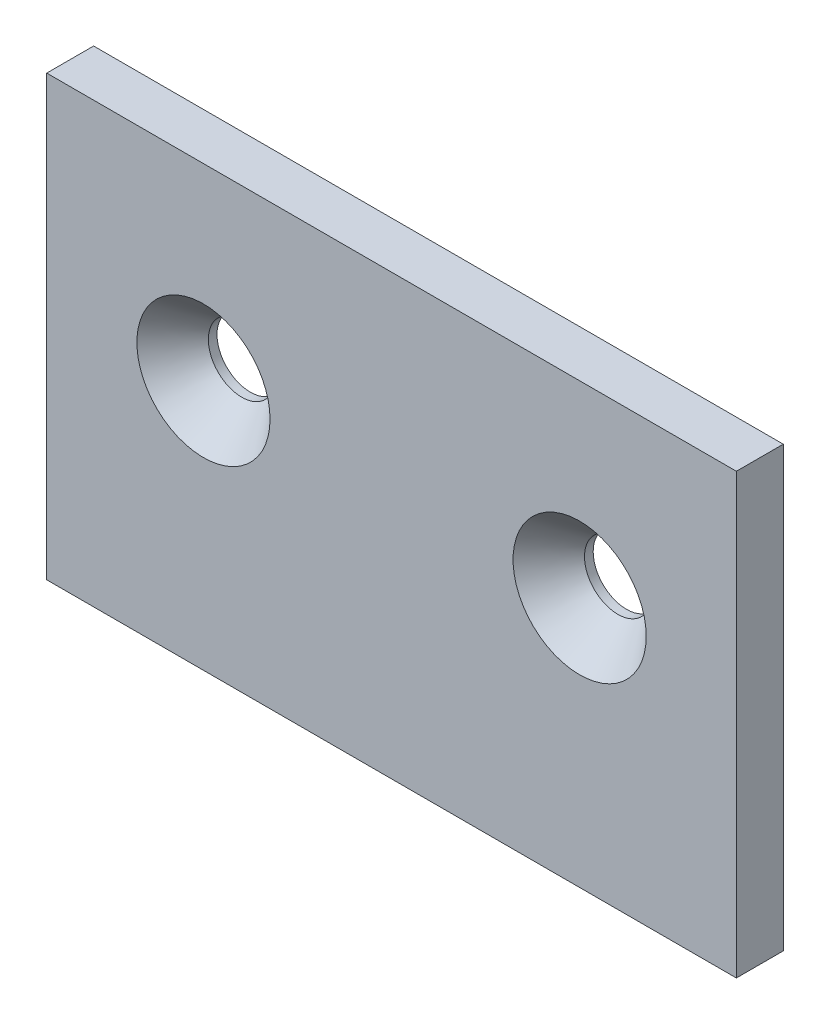
ISO-10303-21;
HEADER;
FILE_DESCRIPTION(('STEP AP214'),'2;1');
FILE_NAME('part.step','',(''),(''),'','','');
FILE_SCHEMA(('AUTOMOTIVE_DESIGN { 1 0 10303 214 1 1 1 1 }'));
ENDSEC;
DATA;
#1=APPLICATION_CONTEXT('core data for automotive mechanical design processes');
#2=APPLICATION_PROTOCOL_DEFINITION('international standard','automotive_design',2000,#1);
#3=PRODUCT_CONTEXT('',#1,'mechanical');
#4=PRODUCT('Part','Part','',(#3));
#5=PRODUCT_RELATED_PRODUCT_CATEGORY('part','',(#4));
#6=PRODUCT_DEFINITION_FORMATION('','',#4);
#7=PRODUCT_DEFINITION_CONTEXT('part definition',#1,'design');
#8=PRODUCT_DEFINITION('design','',#6,#7);
#9=PRODUCT_DEFINITION_SHAPE('','',#8);
#10=(LENGTH_UNIT() NAMED_UNIT(*) SI_UNIT(.MILLI.,.METRE.));
#11=(NAMED_UNIT(*) PLANE_ANGLE_UNIT() SI_UNIT($,.RADIAN.));
#12=(NAMED_UNIT(*) SI_UNIT($,.STERADIAN.) SOLID_ANGLE_UNIT());
#13=UNCERTAINTY_MEASURE_WITH_UNIT(LENGTH_MEASURE(1.E-05),#10,'distance_accuracy_value','');
#14=(GEOMETRIC_REPRESENTATION_CONTEXT(3) GLOBAL_UNCERTAINTY_ASSIGNED_CONTEXT((#13)) GLOBAL_UNIT_ASSIGNED_CONTEXT((#10,
#11,#12)) REPRESENTATION_CONTEXT('',''));
#15=CARTESIAN_POINT('',(0.,0.,0.));
#16=DIRECTION('',(0.,0.,1.));
#17=DIRECTION('',(1.,0.,0.));
#18=AXIS2_PLACEMENT_3D('',#15,#16,#17);
#19=CARTESIAN_POINT('',(0.,0.,4.7498));
#20=DIRECTION('',(0.,0.,-1.));
#21=DIRECTION('',(-1.,0.,0.));
#22=AXIS2_PLACEMENT_3D('',#19,#20,#21);
#23=PLANE('',#22);
#24=DIRECTION('',(0.,-1.,0.));
#25=VECTOR('',#24,1.);
#26=CARTESIAN_POINT('',(-34.925,22.225,4.7498));
#27=LINE('',#26,#25);
#28=CARTESIAN_POINT('',(-34.925,22.225,4.7498));
#29=VERTEX_POINT('',#28);
#30=CARTESIAN_POINT('',(-34.925,-22.225,4.7498));
#31=VERTEX_POINT('',#30);
#32=EDGE_CURVE('E98',#29,#31,#27,.T.);
#33=ORIENTED_EDGE('',*,*,#32,.T.);
#34=DIRECTION('',(1.,0.,0.));
#35=VECTOR('',#34,1.);
#36=CARTESIAN_POINT('',(34.925,-22.225,4.7498));
#37=LINE('',#36,#35);
#38=CARTESIAN_POINT('',(34.925,-22.225,4.7498));
#39=VERTEX_POINT('',#38);
#40=EDGE_CURVE('E93',#31,#39,#37,.T.);
#41=ORIENTED_EDGE('',*,*,#40,.T.);
#42=DIRECTION('',(0.,1.,0.));
#43=VECTOR('',#42,1.);
#44=CARTESIAN_POINT('',(34.925,22.225,4.7498));
#45=LINE('',#44,#43);
#46=CARTESIAN_POINT('',(34.925,22.225,4.7498));
#47=VERTEX_POINT('',#46);
#48=EDGE_CURVE('E96',#39,#47,#45,.T.);
#49=ORIENTED_EDGE('',*,*,#48,.T.);
#50=DIRECTION('',(-1.,0.,0.));
#51=VECTOR('',#50,1.);
#52=CARTESIAN_POINT('',(34.925,22.225,4.7498));
#53=LINE('',#52,#51);
#54=EDGE_CURVE('E63',#47,#29,#53,.T.);
#55=ORIENTED_EDGE('',*,*,#54,.T.);
#56=EDGE_LOOP('',(#33,#41,#49,#55));
#57=FACE_BOUND('',#56,.T.);
#58=CARTESIAN_POINT('',(19.05,3.17500000000001,4.7498));
#59=DIRECTION('',(0.,0.,1.));
#60=DIRECTION('',(1.,0.,0.));
#61=AXIS2_PLACEMENT_3D('',#58,#59,#60);
#62=CIRCLE('',#61,6.7437);
#63=CARTESIAN_POINT('',(25.7937,3.17500000000001,4.7498));
#64=VERTEX_POINT('',#63);
#65=EDGE_CURVE('E142',#64,#64,#62,.T.);
#66=ORIENTED_EDGE('',*,*,#65,.F.);
#67=EDGE_LOOP('',(#66));
#68=FACE_BOUND('',#67,.T.);
#69=CARTESIAN_POINT('',(-19.05,3.17500000000001,4.7498));
#70=DIRECTION('',(0.,0.,1.));
#71=DIRECTION('',(1.,0.,0.));
#72=AXIS2_PLACEMENT_3D('',#69,#70,#71);
#73=CIRCLE('',#72,6.7437);
#74=CARTESIAN_POINT('',(-12.3063,3.17500000000001,4.7498));
#75=VERTEX_POINT('',#74);
#76=EDGE_CURVE('E154',#75,#75,#73,.T.);
#77=ORIENTED_EDGE('',*,*,#76,.F.);
#78=EDGE_LOOP('',(#77));
#79=FACE_BOUND('',#78,.T.);
#80=ADVANCED_FACE('F45',(#57,#68,#79),#23,.F.);
#81=CARTESIAN_POINT('',(-34.925,22.225,4.7498));
#82=DIRECTION('',(1.,0.,0.));
#83=DIRECTION('',(0.,1.,0.));
#84=AXIS2_PLACEMENT_3D('',#81,#82,#83);
#85=PLANE('',#84);
#86=DIRECTION('',(0.,-1.,0.));
#87=VECTOR('',#86,1.);
#88=CARTESIAN_POINT('',(-34.925,22.225,0.));
#89=LINE('',#88,#87);
#90=CARTESIAN_POINT('',(-34.925,22.225,0.));
#91=VERTEX_POINT('',#90);
#92=CARTESIAN_POINT('',(-34.925,-22.225,0.));
#93=VERTEX_POINT('',#92);
#94=EDGE_CURVE('E114',#91,#93,#89,.T.);
#95=ORIENTED_EDGE('',*,*,#94,.T.);
#96=DIRECTION('',(0.,0.,-1.));
#97=VECTOR('',#96,1.);
#98=CARTESIAN_POINT('',(-34.925,-22.225,4.7498));
#99=LINE('',#98,#97);
#100=EDGE_CURVE('E11',#31,#93,#99,.T.);
#101=ORIENTED_EDGE('',*,*,#100,.F.);
#102=ORIENTED_EDGE('',*,*,#32,.F.);
#103=DIRECTION('',(0.,0.,-1.));
#104=VECTOR('',#103,1.);
#105=CARTESIAN_POINT('',(-34.925,22.225,4.7498));
#106=LINE('',#105,#104);
#107=EDGE_CURVE('E110',#29,#91,#106,.T.);
#108=ORIENTED_EDGE('',*,*,#107,.T.);
#109=EDGE_LOOP('',(#95,#101,#102,#108));
#110=FACE_BOUND('',#109,.T.);
#111=ADVANCED_FACE('F47',(#110),#85,.F.);
#112=CARTESIAN_POINT('',(34.925,-22.225,4.7498));
#113=DIRECTION('',(0.,1.,0.));
#114=DIRECTION('',(-1.,0.,0.));
#115=AXIS2_PLACEMENT_3D('',#112,#113,#114);
#116=PLANE('',#115);
#117=DIRECTION('',(1.,0.,0.));
#118=VECTOR('',#117,1.);
#119=CARTESIAN_POINT('',(34.925,-22.225,0.));
#120=LINE('',#119,#118);
#121=CARTESIAN_POINT('',(34.925,-22.225,0.));
#122=VERTEX_POINT('',#121);
#123=EDGE_CURVE('E103',#93,#122,#120,.T.);
#124=ORIENTED_EDGE('',*,*,#123,.T.);
#125=DIRECTION('',(0.,0.,-1.));
#126=VECTOR('',#125,1.);
#127=CARTESIAN_POINT('',(34.925,-22.225,4.7498));
#128=LINE('',#127,#126);
#129=EDGE_CURVE('E55',#39,#122,#128,.T.);
#130=ORIENTED_EDGE('',*,*,#129,.F.);
#131=ORIENTED_EDGE('',*,*,#40,.F.);
#132=ORIENTED_EDGE('',*,*,#100,.T.);
#133=EDGE_LOOP('',(#124,#130,#131,#132));
#134=FACE_BOUND('',#133,.T.);
#135=ADVANCED_FACE('F102',(#134),#116,.F.);
#136=CARTESIAN_POINT('',(34.925,22.225,4.7498));
#137=DIRECTION('',(-1.,0.,0.));
#138=DIRECTION('',(0.,-1.,0.));
#139=AXIS2_PLACEMENT_3D('',#136,#137,#138);
#140=PLANE('',#139);
#141=DIRECTION('',(0.,1.,0.));
#142=VECTOR('',#141,1.);
#143=CARTESIAN_POINT('',(34.925,22.225,0.));
#144=LINE('',#143,#142);
#145=CARTESIAN_POINT('',(34.925,22.225,0.));
#146=VERTEX_POINT('',#145);
#147=EDGE_CURVE('E80',#122,#146,#144,.T.);
#148=ORIENTED_EDGE('',*,*,#147,.T.);
#149=DIRECTION('',(0.,0.,-1.));
#150=VECTOR('',#149,1.);
#151=CARTESIAN_POINT('',(34.925,22.225,4.7498));
#152=LINE('',#151,#150);
#153=EDGE_CURVE('E105',#47,#146,#152,.T.);
#154=ORIENTED_EDGE('',*,*,#153,.F.);
#155=ORIENTED_EDGE('',*,*,#48,.F.);
#156=ORIENTED_EDGE('',*,*,#129,.T.);
#157=EDGE_LOOP('',(#148,#154,#155,#156));
#158=FACE_BOUND('',#157,.T.);
#159=ADVANCED_FACE('F106',(#158),#140,.F.);
#160=CARTESIAN_POINT('',(34.925,22.225,4.7498));
#161=DIRECTION('',(0.,-1.,0.));
#162=DIRECTION('',(1.,0.,0.));
#163=AXIS2_PLACEMENT_3D('',#160,#161,#162);
#164=PLANE('',#163);
#165=DIRECTION('',(-1.,0.,0.));
#166=VECTOR('',#165,1.);
#167=CARTESIAN_POINT('',(34.925,22.225,0.));
#168=LINE('',#167,#166);
#169=EDGE_CURVE('E86',#146,#91,#168,.T.);
#170=ORIENTED_EDGE('',*,*,#169,.T.);
#171=ORIENTED_EDGE('',*,*,#107,.F.);
#172=ORIENTED_EDGE('',*,*,#54,.F.);
#173=ORIENTED_EDGE('',*,*,#153,.T.);
#174=EDGE_LOOP('',(#170,#171,#172,#173));
#175=FACE_BOUND('',#174,.T.);
#176=ADVANCED_FACE('F128',(#175),#164,.F.);
#177=CARTESIAN_POINT('',(0.,0.,0.));
#178=DIRECTION('',(0.,0.,-1.));
#179=DIRECTION('',(-1.,0.,0.));
#180=AXIS2_PLACEMENT_3D('',#177,#178,#179);
#181=PLANE('',#180);
#182=CARTESIAN_POINT('',(-19.05,3.17500000000001,0.));
#183=DIRECTION('',(0.,0.,-1.));
#184=DIRECTION('',(-1.,0.,0.));
#185=AXIS2_PLACEMENT_3D('',#182,#183,#184);
#186=CIRCLE('',#185,3.37819999999997);
#187=CARTESIAN_POINT('',(-22.4282,3.17500000000001,0.));
#188=VERTEX_POINT('',#187);
#189=EDGE_CURVE('E146',#188,#188,#186,.T.);
#190=ORIENTED_EDGE('',*,*,#189,.F.);
#191=EDGE_LOOP('',(#190));
#192=FACE_BOUND('',#191,.T.);
#193=CARTESIAN_POINT('',(19.05,3.17500000000001,0.));
#194=DIRECTION('',(0.,0.,-1.));
#195=DIRECTION('',(-1.,0.,0.));
#196=AXIS2_PLACEMENT_3D('',#193,#194,#195);
#197=CIRCLE('',#196,3.37819999999997);
#198=CARTESIAN_POINT('',(15.6718,3.17500000000001,0.));
#199=VERTEX_POINT('',#198);
#200=EDGE_CURVE('E118',#199,#199,#197,.T.);
#201=ORIENTED_EDGE('',*,*,#200,.F.);
#202=EDGE_LOOP('',(#201));
#203=FACE_BOUND('',#202,.T.);
#204=ORIENTED_EDGE('',*,*,#94,.F.);
#205=ORIENTED_EDGE('',*,*,#169,.F.);
#206=ORIENTED_EDGE('',*,*,#147,.F.);
#207=ORIENTED_EDGE('',*,*,#123,.F.);
#208=EDGE_LOOP('',(#204,#205,#206,#207));
#209=FACE_BOUND('',#208,.T.);
#210=ADVANCED_FACE('F131',(#192,#203,#209),#181,.T.);
#211=CARTESIAN_POINT('',(19.05,3.17500000000001,4.7498));
#212=DIRECTION('',(0.,0.,1.));
#213=DIRECTION('',(1.,0.,0.));
#214=AXIS2_PLACEMENT_3D('',#211,#212,#213);
#215=CYLINDRICAL_SURFACE('',#214,3.37819999999997);
#216=CARTESIAN_POINT('',(19.05,3.17500000000001,0.878235125497591));
#217=DIRECTION('',(0.,0.,1.));
#218=DIRECTION('',(1.,0.,0.));
#219=AXIS2_PLACEMENT_3D('',#216,#217,#218);
#220=CIRCLE('',#219,3.37819999999995);
#221=CARTESIAN_POINT('',(22.4282,3.17500000000001,0.878235125497591));
#222=VERTEX_POINT('',#221);
#223=EDGE_CURVE('E138',#222,#222,#220,.T.);
#224=ORIENTED_EDGE('',*,*,#223,.T.);
#225=EDGE_LOOP('',(#224));
#226=FACE_BOUND('',#225,.T.);
#227=ORIENTED_EDGE('',*,*,#200,.T.);
#228=EDGE_LOOP('',(#227));
#229=FACE_BOUND('',#228,.T.);
#230=ADVANCED_FACE('F170',(#226,#229),#215,.F.);
#231=CARTESIAN_POINT('',(19.05,3.17500000000001,4.7498));
#232=DIRECTION('',(0.,0.,1.));
#233=DIRECTION('',(1.,0.,0.));
#234=AXIS2_PLACEMENT_3D('',#231,#232,#233);
#235=CONICAL_SURFACE('',#234,6.7437,0.71558499331767);
#236=ORIENTED_EDGE('',*,*,#223,.F.);
#237=EDGE_LOOP('',(#236));
#238=FACE_BOUND('',#237,.T.);
#239=ORIENTED_EDGE('',*,*,#65,.T.);
#240=EDGE_LOOP('',(#239));
#241=FACE_BOUND('',#240,.T.);
#242=ADVANCED_FACE('F211',(#238,#241),#235,.F.);
#243=CARTESIAN_POINT('',(-19.05,3.17500000000001,4.7498));
#244=DIRECTION('',(0.,0.,1.));
#245=DIRECTION('',(1.,0.,0.));
#246=AXIS2_PLACEMENT_3D('',#243,#244,#245);
#247=CYLINDRICAL_SURFACE('',#246,3.37819999999997);
#248=CARTESIAN_POINT('',(-19.05,3.17500000000001,0.878235125497591));
#249=DIRECTION('',(0.,0.,1.));
#250=DIRECTION('',(1.,0.,0.));
#251=AXIS2_PLACEMENT_3D('',#248,#249,#250);
#252=CIRCLE('',#251,3.37819999999995);
#253=CARTESIAN_POINT('',(-15.6718,3.17500000000001,0.878235125497591));
#254=VERTEX_POINT('',#253);
#255=EDGE_CURVE('E150',#254,#254,#252,.T.);
#256=ORIENTED_EDGE('',*,*,#255,.T.);
#257=EDGE_LOOP('',(#256));
#258=FACE_BOUND('',#257,.T.);
#259=ORIENTED_EDGE('',*,*,#189,.T.);
#260=EDGE_LOOP('',(#259));
#261=FACE_BOUND('',#260,.T.);
#262=ADVANCED_FACE('F220',(#258,#261),#247,.F.);
#263=CARTESIAN_POINT('',(-19.05,3.17500000000001,4.7498));
#264=DIRECTION('',(0.,0.,1.));
#265=DIRECTION('',(1.,0.,0.));
#266=AXIS2_PLACEMENT_3D('',#263,#264,#265);
#267=CONICAL_SURFACE('',#266,6.7437,0.71558499331767);
#268=ORIENTED_EDGE('',*,*,#255,.F.);
#269=EDGE_LOOP('',(#268));
#270=FACE_BOUND('',#269,.T.);
#271=ORIENTED_EDGE('',*,*,#76,.T.);
#272=EDGE_LOOP('',(#271));
#273=FACE_BOUND('',#272,.T.);
#274=ADVANCED_FACE('F159',(#270,#273),#267,.F.);
#275=CLOSED_SHELL('',(#80,#111,#135,#159,#176,#210,#230,#242,#262,#274));
#276=MANIFOLD_SOLID_BREP('B2',#275);
#277=ADVANCED_BREP_SHAPE_REPRESENTATION('',(#18,#276),#14);
#278=SHAPE_DEFINITION_REPRESENTATION(#9,#277);
ENDSEC;
END-ISO-10303-21;
